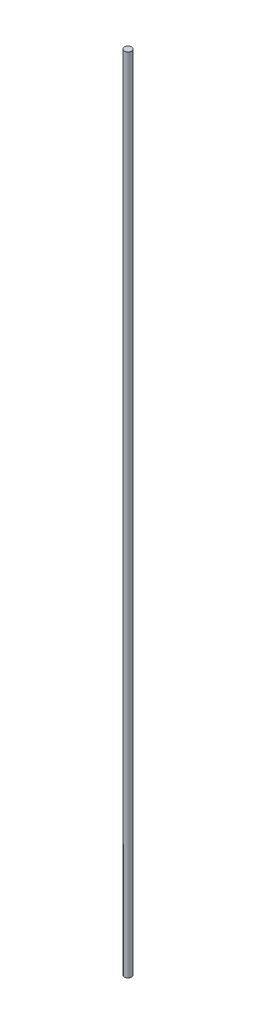
ISO-10303-21;
HEADER;
FILE_DESCRIPTION(('STEP AP214'),'2;1');
FILE_NAME('part.step','',(''),(''),'','','');
FILE_SCHEMA(('AUTOMOTIVE_DESIGN { 1 0 10303 214 1 1 1 1 }'));
ENDSEC;
DATA;
#1=APPLICATION_CONTEXT('core data for automotive mechanical design processes');
#2=APPLICATION_PROTOCOL_DEFINITION('international standard','automotive_design',2000,#1);
#3=PRODUCT_CONTEXT('',#1,'mechanical');
#4=PRODUCT('Part','Part','',(#3));
#5=PRODUCT_RELATED_PRODUCT_CATEGORY('part','',(#4));
#6=PRODUCT_DEFINITION_FORMATION('','',#4);
#7=PRODUCT_DEFINITION_CONTEXT('part definition',#1,'design');
#8=PRODUCT_DEFINITION('design','',#6,#7);
#9=PRODUCT_DEFINITION_SHAPE('','',#8);
#10=(LENGTH_UNIT() NAMED_UNIT(*) SI_UNIT(.MILLI.,.METRE.));
#11=(NAMED_UNIT(*) PLANE_ANGLE_UNIT() SI_UNIT($,.RADIAN.));
#12=(NAMED_UNIT(*) SI_UNIT($,.STERADIAN.) SOLID_ANGLE_UNIT());
#13=UNCERTAINTY_MEASURE_WITH_UNIT(LENGTH_MEASURE(1.E-05),#10,'distance_accuracy_value','');
#14=(GEOMETRIC_REPRESENTATION_CONTEXT(3) GLOBAL_UNCERTAINTY_ASSIGNED_CONTEXT((#13)) GLOBAL_UNIT_ASSIGNED_CONTEXT((#10,
#11,#12)) REPRESENTATION_CONTEXT('',''));
#15=CARTESIAN_POINT('',(0.,0.,0.));
#16=DIRECTION('',(0.,0.,1.));
#17=DIRECTION('',(1.,0.,0.));
#18=AXIS2_PLACEMENT_3D('',#15,#16,#17);
#19=CARTESIAN_POINT('',(0.,1100.,0.));
#20=DIRECTION('',(0.,-1.,0.));
#21=DIRECTION('',(0.,0.,-1.));
#22=AXIS2_PLACEMENT_3D('',#19,#20,#21);
#23=CYLINDRICAL_SURFACE('',#22,5.);
#24=CARTESIAN_POINT('',(0.,1100.,0.));
#25=DIRECTION('',(0.,1.,0.));
#26=DIRECTION('',(0.,0.,1.));
#27=AXIS2_PLACEMENT_3D('',#24,#25,#26);
#28=CIRCLE('',#27,5.);
#29=CARTESIAN_POINT('',(0.,1100.,5.));
#30=VERTEX_POINT('',#29);
#31=EDGE_CURVE('E10',#30,#30,#28,.T.);
#32=ORIENTED_EDGE('',*,*,#31,.F.);
#33=EDGE_LOOP('',(#32));
#34=FACE_BOUND('',#33,.T.);
#35=CARTESIAN_POINT('',(0.,0.,0.));
#36=DIRECTION('',(0.,1.,0.));
#37=DIRECTION('',(0.,0.,1.));
#38=AXIS2_PLACEMENT_3D('',#35,#36,#37);
#39=CIRCLE('',#38,5.);
#40=CARTESIAN_POINT('',(0.,0.,5.));
#41=VERTEX_POINT('',#40);
#42=EDGE_CURVE('E34',#41,#41,#39,.T.);
#43=ORIENTED_EDGE('',*,*,#42,.T.);
#44=EDGE_LOOP('',(#43));
#45=FACE_BOUND('',#44,.T.);
#46=ADVANCED_FACE('F31',(#34,#45),#23,.T.);
#47=CARTESIAN_POINT('',(0.,1100.,0.));
#48=DIRECTION('',(0.,1.,0.));
#49=DIRECTION('',(0.,0.,1.));
#50=AXIS2_PLACEMENT_3D('',#47,#48,#49);
#51=PLANE('',#50);
#52=ORIENTED_EDGE('',*,*,#31,.T.);
#53=EDGE_LOOP('',(#52));
#54=FACE_BOUND('',#53,.T.);
#55=ADVANCED_FACE('F46',(#54),#51,.T.);
#56=CARTESIAN_POINT('',(0.,0.,0.));
#57=DIRECTION('',(0.,1.,0.));
#58=DIRECTION('',(0.,0.,1.));
#59=AXIS2_PLACEMENT_3D('',#56,#57,#58);
#60=PLANE('',#59);
#61=ORIENTED_EDGE('',*,*,#42,.F.);
#62=EDGE_LOOP('',(#61));
#63=FACE_BOUND('',#62,.T.);
#64=ADVANCED_FACE('F44',(#63),#60,.F.);
#65=CLOSED_SHELL('',(#46,#55,#64));
#66=MANIFOLD_SOLID_BREP('B2',#65);
#67=ADVANCED_BREP_SHAPE_REPRESENTATION('',(#18,#66),#14);
#68=SHAPE_DEFINITION_REPRESENTATION(#9,#67);
ENDSEC;
END-ISO-10303-21;
